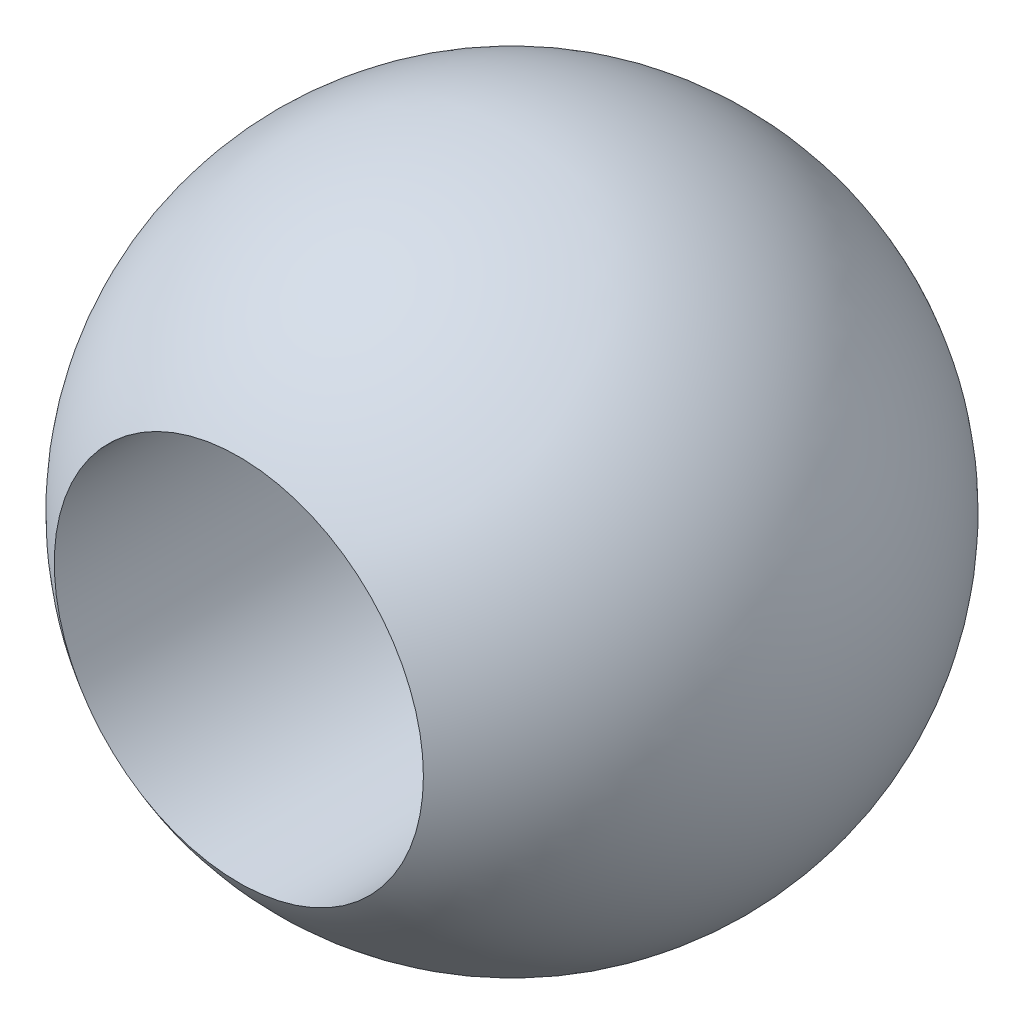
ISO-10303-21;
HEADER;
FILE_DESCRIPTION(('STEP AP214'),'2;1');
FILE_NAME('part.step','',(''),(''),'','','');
FILE_SCHEMA(('AUTOMOTIVE_DESIGN { 1 0 10303 214 1 1 1 1 }'));
ENDSEC;
DATA;
#1=APPLICATION_CONTEXT('core data for automotive mechanical design processes');
#2=APPLICATION_PROTOCOL_DEFINITION('international standard','automotive_design',2000,#1);
#3=PRODUCT_CONTEXT('',#1,'mechanical');
#4=PRODUCT('Part','Part','',(#3));
#5=PRODUCT_RELATED_PRODUCT_CATEGORY('part','',(#4));
#6=PRODUCT_DEFINITION_FORMATION('','',#4);
#7=PRODUCT_DEFINITION_CONTEXT('part definition',#1,'design');
#8=PRODUCT_DEFINITION('design','',#6,#7);
#9=PRODUCT_DEFINITION_SHAPE('','',#8);
#10=(LENGTH_UNIT() NAMED_UNIT(*) SI_UNIT(.MILLI.,.METRE.));
#11=(NAMED_UNIT(*) PLANE_ANGLE_UNIT() SI_UNIT($,.RADIAN.));
#12=(NAMED_UNIT(*) SI_UNIT($,.STERADIAN.) SOLID_ANGLE_UNIT());
#13=UNCERTAINTY_MEASURE_WITH_UNIT(LENGTH_MEASURE(1.E-05),#10,'distance_accuracy_value','');
#14=(GEOMETRIC_REPRESENTATION_CONTEXT(3) GLOBAL_UNCERTAINTY_ASSIGNED_CONTEXT((#13)) GLOBAL_UNIT_ASSIGNED_CONTEXT((#10,
#11,#12)) REPRESENTATION_CONTEXT('',''));
#15=CARTESIAN_POINT('',(0.,0.,0.));
#16=DIRECTION('',(0.,0.,1.));
#17=DIRECTION('',(1.,0.,0.));
#18=AXIS2_PLACEMENT_3D('',#15,#16,#17);
#19=CARTESIAN_POINT('',(0.,0.,0.));
#20=DIRECTION('',(0.,-1.,0.));
#21=DIRECTION('',(-1.,0.,0.));
#22=AXIS2_PLACEMENT_3D('',#19,#20,#21);
#23=SPHERICAL_SURFACE('',#22,14.2875);
#24=CARTESIAN_POINT('',(0.,0.,0.));
#25=DIRECTION('',(0.,0.,-1.));
#26=DIRECTION('',(-1.,0.,0.));
#27=AXIS2_PLACEMENT_3D('',#24,#25,#26);
#28=SPHERICAL_SURFACE('',#27,14.2875);
#29=CARTESIAN_POINT('',(0.,0.,11.8377639886087));
#30=DIRECTION('',(0.,0.,-1.));
#31=DIRECTION('',(-1.,0.,0.));
#32=AXIS2_PLACEMENT_3D('',#29,#30,#31);
#33=CIRCLE('',#32,8.);
#34=CARTESIAN_POINT('',(8.,0.,11.8377639886087));
#35=VERTEX_POINT('',#34);
#36=EDGE_CURVE('E10',#35,#35,#33,.F.);
#37=ORIENTED_EDGE('',*,*,#36,.F.);
#38=EDGE_LOOP('',(#37));
#39=FACE_BOUND('',#38,.T.);
#40=CARTESIAN_POINT('',(0.,0.,-11.8377639886087));
#41=DIRECTION('',(0.,0.,1.));
#42=DIRECTION('',(1.,0.,0.));
#43=AXIS2_PLACEMENT_3D('',#40,#41,#42);
#44=CIRCLE('',#43,8.);
#45=CARTESIAN_POINT('',(8.,0.,-11.8377639886087));
#46=VERTEX_POINT('',#45);
#47=EDGE_CURVE('E37',#46,#46,#44,.F.);
#48=ORIENTED_EDGE('',*,*,#47,.F.);
#49=EDGE_LOOP('',(#48));
#50=FACE_BOUND('',#49,.T.);
#51=ADVANCED_FACE('F31',(#39,#50),#28,.T.);
#52=CARTESIAN_POINT('',(0.,0.,-14.2875));
#53=DIRECTION('',(0.,0.,1.));
#54=DIRECTION('',(1.,0.,0.));
#55=AXIS2_PLACEMENT_3D('',#52,#53,#54);
#56=CYLINDRICAL_SURFACE('',#55,8.);
#57=CARTESIAN_POINT('',(8.,0.,11.8377639886087));
#58=CARTESIAN_POINT('',(8.,0.,11.5911439055126));
#59=CARTESIAN_POINT('',(8.,0.,11.3445238224166));
#60=CARTESIAN_POINT('',(8.,0.,10.8512836562246));
#61=CARTESIAN_POINT('',(8.,0.,10.6046635731286));
#62=CARTESIAN_POINT('',(8.,0.,10.1114234069366));
#63=CARTESIAN_POINT('',(8.,0.,9.86480332384055));
#64=CARTESIAN_POINT('',(8.,0.,9.37156315764852));
#65=CARTESIAN_POINT('',(8.,0.,9.1249430745525));
#66=CARTESIAN_POINT('',(8.,0.,8.63170290836048));
#67=CARTESIAN_POINT('',(8.,0.,8.38508282526447));
#68=CARTESIAN_POINT('',(8.,0.,7.89184265907244));
#69=CARTESIAN_POINT('',(8.,0.,7.64522257597642));
#70=CARTESIAN_POINT('',(8.,0.,7.1519824097844));
#71=CARTESIAN_POINT('',(8.,0.,6.90536232668838));
#72=CARTESIAN_POINT('',(8.,0.,6.41212216049635));
#73=CARTESIAN_POINT('',(8.,0.,6.16550207740034));
#74=CARTESIAN_POINT('',(8.,0.,5.67226191120831));
#75=CARTESIAN_POINT('',(8.,0.,5.4256418281123));
#76=CARTESIAN_POINT('',(8.,0.,4.93240166192027));
#77=CARTESIAN_POINT('',(8.,0.,4.68578157882426));
#78=CARTESIAN_POINT('',(8.,0.,4.19254141263223));
#79=CARTESIAN_POINT('',(8.,0.,3.94592132953622));
#80=CARTESIAN_POINT('',(8.,0.,3.45268116334419));
#81=CARTESIAN_POINT('',(8.,0.,3.20606108024818));
#82=CARTESIAN_POINT('',(8.,0.,2.71282091405615));
#83=CARTESIAN_POINT('',(8.,0.,2.46620083096013));
#84=CARTESIAN_POINT('',(8.,0.,1.97296066476811));
#85=CARTESIAN_POINT('',(8.,0.,1.72634058167209));
#86=CARTESIAN_POINT('',(8.,0.,1.23310041548007));
#87=CARTESIAN_POINT('',(8.,0.,0.986480332384053));
#88=CARTESIAN_POINT('',(8.,0.,0.493240166192026));
#89=CARTESIAN_POINT('',(8.,0.,0.246620083096012));
#90=CARTESIAN_POINT('',(8.,0.,-0.246620083096016));
#91=CARTESIAN_POINT('',(8.,0.,-0.49324016619203));
#92=CARTESIAN_POINT('',(8.,0.,-0.986480332384057));
#93=CARTESIAN_POINT('',(8.,0.,-1.23310041548007));
#94=CARTESIAN_POINT('',(8.,0.,-1.7263405816721));
#95=CARTESIAN_POINT('',(8.,0.,-1.97296066476811));
#96=CARTESIAN_POINT('',(8.,0.,-2.46620083096014));
#97=CARTESIAN_POINT('',(8.,0.,-2.71282091405615));
#98=CARTESIAN_POINT('',(8.,0.,-3.20606108024818));
#99=CARTESIAN_POINT('',(8.,0.,-3.45268116334419));
#100=CARTESIAN_POINT('',(8.,0.,-3.94592132953622));
#101=CARTESIAN_POINT('',(8.,0.,-4.19254141263224));
#102=CARTESIAN_POINT('',(8.,0.,-4.68578157882426));
#103=CARTESIAN_POINT('',(8.,0.,-4.93240166192028));
#104=CARTESIAN_POINT('',(8.,0.,-5.42564182811231));
#105=CARTESIAN_POINT('',(8.,0.,-5.67226191120832));
#106=CARTESIAN_POINT('',(8.,0.,-6.16550207740035));
#107=CARTESIAN_POINT('',(8.,0.,-6.41212216049636));
#108=CARTESIAN_POINT('',(8.,0.,-6.90536232668839));
#109=CARTESIAN_POINT('',(8.,0.,-7.1519824097844));
#110=CARTESIAN_POINT('',(8.,0.,-7.64522257597643));
#111=CARTESIAN_POINT('',(8.,0.,-7.89184265907244));
#112=CARTESIAN_POINT('',(8.,0.,-8.38508282526447));
#113=CARTESIAN_POINT('',(8.,0.,-8.63170290836048));
#114=CARTESIAN_POINT('',(8.,0.,-9.12494307455251));
#115=CARTESIAN_POINT('',(8.,0.,-9.37156315764852));
#116=CARTESIAN_POINT('',(8.,0.,-9.86480332384055));
#117=CARTESIAN_POINT('',(8.,0.,-10.1114234069366));
#118=CARTESIAN_POINT('',(8.,0.,-10.6046635731286));
#119=CARTESIAN_POINT('',(8.,0.,-10.8512836562246));
#120=CARTESIAN_POINT('',(8.,0.,-11.3445238224166));
#121=CARTESIAN_POINT('',(8.,0.,-11.5911439055126));
#122=CARTESIAN_POINT('',(8.,0.,-11.8377639886087));
#123=B_SPLINE_CURVE_WITH_KNOTS('',3,(#57,#58,#59,#60,#61,#62,#63,#64,#65,#66,#67,#68,#69,#70,
#71,#72,#73,#74,#75,#76,#77,#78,#79,#80,#81,#82,#83,#84,#85,#86,#87,#88,#89,#90,#91,#92,#93,#94,
#95,#96,#97,#98,#99,#100,#101,#102,#103,#104,#105,#106,#107,#108,#109,#110,#111,#112,#113,#114,
#115,#116,#117,#118,#119,#120,#121,#122),.UNSPECIFIED.,.F.,.F.,(4,2,2,2,2,2,2,2,2,2,2,2,2,2,2,2,
2,2,2,2,2,2,2,2,2,2,2,2,2,2,2,2,4),(0.,0.73986024928804,1.47972049857608,2.21958074786412,
2.95944099715217,3.69930124644021,4.43916149572825,5.17902174501629,5.91888199430433,
6.65874224359237,7.39860249288041,8.13846274216845,8.87832299145649,9.61818324074454,
10.3580434900326,11.0979037393206,11.8377639886087,12.5776242378967,13.3174844871847,
14.0573447364728,14.7972049857608,15.5370652350489,16.2769254843369,17.016785733625,
17.756645982913,18.496506232201,19.2363664814891,19.9762267307771,20.7160869800652,
21.4559472293532,22.1958074786412,22.9356677279293,23.6755279772173),.UNSPECIFIED.);
#124=EDGE_CURVE('BSEAM43',#35,#46,#123,.T.);
#125=ORIENTED_EDGE('',*,*,#36,.T.);
#126=ORIENTED_EDGE('',*,*,#47,.T.);
#127=ORIENTED_EDGE('',*,*,#124,.T.);
#128=ORIENTED_EDGE('',*,*,#124,.F.);
#129=EDGE_LOOP('',(#125,#127,#126,#128));
#130=FACE_BOUND('',#129,.T.);
#131=ADVANCED_FACE('F43',(#130),#56,.F.);
#132=CLOSED_SHELL('',(#51,#131));
#133=MANIFOLD_SOLID_BREP('B2',#132);
#134=ADVANCED_BREP_SHAPE_REPRESENTATION('',(#18,#133),#14);
#135=SHAPE_DEFINITION_REPRESENTATION(#9,#134);
ENDSEC;
END-ISO-10303-21;
